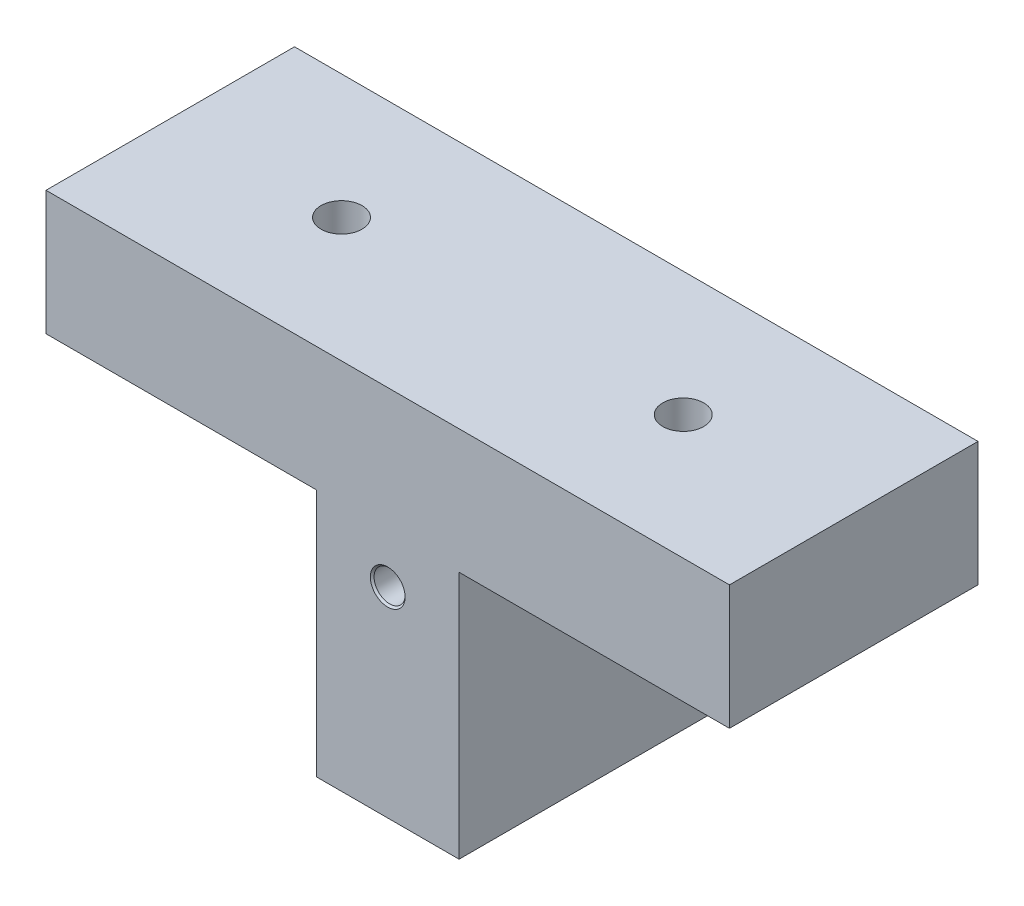
ISO-10303-21;
HEADER;
FILE_DESCRIPTION(('STEP AP214'),'2;1');
FILE_NAME('part.step','',(''),(''),'','','');
FILE_SCHEMA(('AUTOMOTIVE_DESIGN { 1 0 10303 214 1 1 1 1 }'));
ENDSEC;
DATA;
#1=APPLICATION_CONTEXT('core data for automotive mechanical design processes');
#2=APPLICATION_PROTOCOL_DEFINITION('international standard','automotive_design',2000,#1);
#3=PRODUCT_CONTEXT('',#1,'mechanical');
#4=PRODUCT('Part','Part','',(#3));
#5=PRODUCT_RELATED_PRODUCT_CATEGORY('part','',(#4));
#6=PRODUCT_DEFINITION_FORMATION('','',#4);
#7=PRODUCT_DEFINITION_CONTEXT('part definition',#1,'design');
#8=PRODUCT_DEFINITION('design','',#6,#7);
#9=PRODUCT_DEFINITION_SHAPE('','',#8);
#10=(LENGTH_UNIT() NAMED_UNIT(*) SI_UNIT(.MILLI.,.METRE.));
#11=(NAMED_UNIT(*) PLANE_ANGLE_UNIT() SI_UNIT($,.RADIAN.));
#12=(NAMED_UNIT(*) SI_UNIT($,.STERADIAN.) SOLID_ANGLE_UNIT());
#13=UNCERTAINTY_MEASURE_WITH_UNIT(LENGTH_MEASURE(1.E-05),#10,'distance_accuracy_value','');
#14=(GEOMETRIC_REPRESENTATION_CONTEXT(3) GLOBAL_UNCERTAINTY_ASSIGNED_CONTEXT((#13)) GLOBAL_UNIT_ASSIGNED_CONTEXT((#10,
#11,#12)) REPRESENTATION_CONTEXT('',''));
#15=CARTESIAN_POINT('',(0.,0.,0.));
#16=DIRECTION('',(0.,0.,1.));
#17=DIRECTION('',(1.,0.,0.));
#18=AXIS2_PLACEMENT_3D('',#15,#16,#17);
#19=CARTESIAN_POINT('',(27.5,5.,20.));
#20=DIRECTION('',(-1.,0.,0.));
#21=DIRECTION('',(0.,-1.,0.));
#22=AXIS2_PLACEMENT_3D('',#19,#20,#21);
#23=PLANE('',#22);
#24=DIRECTION('',(0.,1.,0.));
#25=VECTOR('',#24,1.);
#26=CARTESIAN_POINT('',(27.5,5.,0.));
#27=LINE('',#26,#25);
#28=CARTESIAN_POINT('',(27.5,-5.,0.));
#29=VERTEX_POINT('',#28);
#30=CARTESIAN_POINT('',(27.5,5.,0.));
#31=VERTEX_POINT('',#30);
#32=EDGE_CURVE('E139',#29,#31,#27,.T.);
#33=ORIENTED_EDGE('',*,*,#32,.T.);
#34=DIRECTION('',(0.,0.,-1.));
#35=VECTOR('',#34,1.);
#36=CARTESIAN_POINT('',(27.5,5.,20.));
#37=LINE('',#36,#35);
#38=CARTESIAN_POINT('',(27.5,5.,20.));
#39=VERTEX_POINT('',#38);
#40=EDGE_CURVE('E11',#39,#31,#37,.T.);
#41=ORIENTED_EDGE('',*,*,#40,.F.);
#42=DIRECTION('',(0.,1.,0.));
#43=VECTOR('',#42,1.);
#44=CARTESIAN_POINT('',(27.5,5.,20.));
#45=LINE('',#44,#43);
#46=CARTESIAN_POINT('',(27.5,-5.,20.));
#47=VERTEX_POINT('',#46);
#48=EDGE_CURVE('E162',#47,#39,#45,.T.);
#49=ORIENTED_EDGE('',*,*,#48,.F.);
#50=DIRECTION('',(0.,0.,-1.));
#51=VECTOR('',#50,1.);
#52=CARTESIAN_POINT('',(27.5,-5.,20.));
#53=LINE('',#52,#51);
#54=EDGE_CURVE('E135',#47,#29,#53,.T.);
#55=ORIENTED_EDGE('',*,*,#54,.T.);
#56=EDGE_LOOP('',(#33,#41,#49,#55));
#57=FACE_BOUND('',#56,.T.);
#58=ADVANCED_FACE('F38',(#57),#23,.F.);
#59=CARTESIAN_POINT('',(-27.5,5.,20.));
#60=DIRECTION('',(0.,-1.,0.));
#61=DIRECTION('',(0.,0.,-1.));
#62=AXIS2_PLACEMENT_3D('',#59,#60,#61);
#63=PLANE('',#62);
#64=CARTESIAN_POINT('',(13.78,4.99999999999999,10.));
#65=DIRECTION('',(0.,-1.,0.));
#66=DIRECTION('',(0.,0.,-1.));
#67=AXIS2_PLACEMENT_3D('',#64,#65,#66);
#68=CIRCLE('',#67,1.64999999999999);
#69=CARTESIAN_POINT('',(13.78,4.99999999999999,8.35000000000001));
#70=VERTEX_POINT('',#69);
#71=EDGE_CURVE('E229',#70,#70,#68,.T.);
#72=ORIENTED_EDGE('',*,*,#71,.T.);
#73=EDGE_LOOP('',(#72));
#74=FACE_BOUND('',#73,.T.);
#75=CARTESIAN_POINT('',(-13.72,4.99999999999999,10.));
#76=DIRECTION('',(0.,-1.,0.));
#77=DIRECTION('',(0.,0.,-1.));
#78=AXIS2_PLACEMENT_3D('',#75,#76,#77);
#79=CIRCLE('',#78,1.64999999999999);
#80=CARTESIAN_POINT('',(-13.72,4.99999999999999,8.35000000000001));
#81=VERTEX_POINT('',#80);
#82=EDGE_CURVE('E217',#81,#81,#79,.T.);
#83=ORIENTED_EDGE('',*,*,#82,.T.);
#84=EDGE_LOOP('',(#83));
#85=FACE_BOUND('',#84,.T.);
#86=DIRECTION('',(-1.,0.,0.));
#87=VECTOR('',#86,1.);
#88=CARTESIAN_POINT('',(-27.5,5.,0.));
#89=LINE('',#88,#87);
#90=CARTESIAN_POINT('',(-27.5,5.,0.));
#91=VERTEX_POINT('',#90);
#92=EDGE_CURVE('E143',#31,#91,#89,.T.);
#93=ORIENTED_EDGE('',*,*,#92,.T.);
#94=DIRECTION('',(0.,0.,-1.));
#95=VECTOR('',#94,1.);
#96=CARTESIAN_POINT('',(-27.5,5.,20.));
#97=LINE('',#96,#95);
#98=CARTESIAN_POINT('',(-27.5,5.,20.));
#99=VERTEX_POINT('',#98);
#100=EDGE_CURVE('E47',#99,#91,#97,.T.);
#101=ORIENTED_EDGE('',*,*,#100,.F.);
#102=DIRECTION('',(-1.,0.,0.));
#103=VECTOR('',#102,1.);
#104=CARTESIAN_POINT('',(-27.5,5.,20.));
#105=LINE('',#104,#103);
#106=EDGE_CURVE('E98',#39,#99,#105,.T.);
#107=ORIENTED_EDGE('',*,*,#106,.F.);
#108=ORIENTED_EDGE('',*,*,#40,.T.);
#109=EDGE_LOOP('',(#93,#101,#107,#108));
#110=FACE_BOUND('',#109,.T.);
#111=ADVANCED_FACE('F256',(#74,#85,#110),#63,.F.);
#112=CARTESIAN_POINT('',(-27.5,5.,20.));
#113=DIRECTION('',(1.,0.,0.));
#114=DIRECTION('',(0.,0.,-1.));
#115=AXIS2_PLACEMENT_3D('',#112,#113,#114);
#116=PLANE('',#115);
#117=DIRECTION('',(0.,-1.,0.));
#118=VECTOR('',#117,1.);
#119=CARTESIAN_POINT('',(-27.5,5.,0.));
#120=LINE('',#119,#118);
#121=CARTESIAN_POINT('',(-27.5,-5.,0.));
#122=VERTEX_POINT('',#121);
#123=EDGE_CURVE('E147',#91,#122,#120,.T.);
#124=ORIENTED_EDGE('',*,*,#123,.T.);
#125=DIRECTION('',(0.,0.,-1.));
#126=VECTOR('',#125,1.);
#127=CARTESIAN_POINT('',(-27.5,-5.,20.));
#128=LINE('',#127,#126);
#129=CARTESIAN_POINT('',(-27.5,-5.,20.));
#130=VERTEX_POINT('',#129);
#131=EDGE_CURVE('E173',#130,#122,#128,.T.);
#132=ORIENTED_EDGE('',*,*,#131,.F.);
#133=DIRECTION('',(0.,-1.,0.));
#134=VECTOR('',#133,1.);
#135=CARTESIAN_POINT('',(-27.5,5.,20.));
#136=LINE('',#135,#134);
#137=EDGE_CURVE('E183',#99,#130,#136,.T.);
#138=ORIENTED_EDGE('',*,*,#137,.F.);
#139=ORIENTED_EDGE('',*,*,#100,.T.);
#140=EDGE_LOOP('',(#124,#132,#138,#139));
#141=FACE_BOUND('',#140,.T.);
#142=ADVANCED_FACE('F181',(#141),#116,.F.);
#143=CARTESIAN_POINT('',(-27.5,-5.,20.));
#144=DIRECTION('',(0.,1.,0.));
#145=DIRECTION('',(0.,0.,1.));
#146=AXIS2_PLACEMENT_3D('',#143,#144,#145);
#147=PLANE('',#146);
#148=CARTESIAN_POINT('',(-13.72,-5.,10.));
#149=DIRECTION('',(0.,-1.,0.));
#150=DIRECTION('',(0.,0.,-1.));
#151=AXIS2_PLACEMENT_3D('',#148,#149,#150);
#152=CIRCLE('',#151,1.675);
#153=CARTESIAN_POINT('',(-13.72,-5.,8.325));
#154=VERTEX_POINT('',#153);
#155=EDGE_CURVE('E225',#154,#154,#152,.T.);
#156=ORIENTED_EDGE('',*,*,#155,.F.);
#157=EDGE_LOOP('',(#156));
#158=FACE_BOUND('',#157,.T.);
#159=DIRECTION('',(1.,0.,0.));
#160=VECTOR('',#159,1.);
#161=CARTESIAN_POINT('',(-27.5,-5.,0.));
#162=LINE('',#161,#160);
#163=CARTESIAN_POINT('',(-5.74072012964691,-5.,0.));
#164=VERTEX_POINT('',#163);
#165=EDGE_CURVE('E150',#122,#164,#162,.T.);
#166=ORIENTED_EDGE('',*,*,#165,.T.);
#167=DIRECTION('',(0.,0.,-1.));
#168=VECTOR('',#167,1.);
#169=CARTESIAN_POINT('',(-5.74072012964691,-5.,20.));
#170=LINE('',#169,#168);
#171=CARTESIAN_POINT('',(-5.74072012964691,-5.,20.));
#172=VERTEX_POINT('',#171);
#173=EDGE_CURVE('E169',#172,#164,#170,.T.);
#174=ORIENTED_EDGE('',*,*,#173,.F.);
#175=DIRECTION('',(1.,0.,0.));
#176=VECTOR('',#175,1.);
#177=CARTESIAN_POINT('',(-27.5,-5.,20.));
#178=LINE('',#177,#176);
#179=EDGE_CURVE('E196',#130,#172,#178,.T.);
#180=ORIENTED_EDGE('',*,*,#179,.F.);
#181=ORIENTED_EDGE('',*,*,#131,.T.);
#182=EDGE_LOOP('',(#166,#174,#180,#181));
#183=FACE_BOUND('',#182,.T.);
#184=ADVANCED_FACE('F191',(#158,#183),#147,.F.);
#185=CARTESIAN_POINT('',(-5.74072012964691,-5.,20.));
#186=DIRECTION('',(1.,0.,0.));
#187=DIRECTION('',(0.,1.,0.));
#188=AXIS2_PLACEMENT_3D('',#185,#186,#187);
#189=PLANE('',#188);
#190=DIRECTION('',(0.,-1.,0.));
#191=VECTOR('',#190,1.);
#192=CARTESIAN_POINT('',(-5.74072012964691,-5.,0.));
#193=LINE('',#192,#191);
#194=CARTESIAN_POINT('',(-5.74072012964691,-25.,0.));
#195=VERTEX_POINT('',#194);
#196=EDGE_CURVE('E153',#164,#195,#193,.T.);
#197=ORIENTED_EDGE('',*,*,#196,.T.);
#198=DIRECTION('',(0.,0.,-1.));
#199=VECTOR('',#198,1.);
#200=CARTESIAN_POINT('',(-5.74072012964691,-25.,20.));
#201=LINE('',#200,#199);
#202=CARTESIAN_POINT('',(-5.74072012964691,-25.,20.));
#203=VERTEX_POINT('',#202);
#204=EDGE_CURVE('E128',#203,#195,#201,.T.);
#205=ORIENTED_EDGE('',*,*,#204,.F.);
#206=DIRECTION('',(0.,-1.,0.));
#207=VECTOR('',#206,1.);
#208=CARTESIAN_POINT('',(-5.74072012964691,-5.,20.));
#209=LINE('',#208,#207);
#210=EDGE_CURVE('E117',#172,#203,#209,.T.);
#211=ORIENTED_EDGE('',*,*,#210,.F.);
#212=ORIENTED_EDGE('',*,*,#173,.T.);
#213=EDGE_LOOP('',(#197,#205,#211,#212));
#214=FACE_BOUND('',#213,.T.);
#215=ADVANCED_FACE('F194',(#214),#189,.F.);
#216=CARTESIAN_POINT('',(-5.74072012964691,-25.,20.));
#217=DIRECTION('',(0.,1.,0.));
#218=DIRECTION('',(0.,0.,1.));
#219=AXIS2_PLACEMENT_3D('',#216,#217,#218);
#220=PLANE('',#219);
#221=DIRECTION('',(1.,0.,0.));
#222=VECTOR('',#221,1.);
#223=CARTESIAN_POINT('',(-5.74072012964691,-25.,0.));
#224=LINE('',#223,#222);
#225=CARTESIAN_POINT('',(5.74072012964693,-25.,0.));
#226=VERTEX_POINT('',#225);
#227=EDGE_CURVE('E126',#195,#226,#224,.T.);
#228=ORIENTED_EDGE('',*,*,#227,.T.);
#229=DIRECTION('',(0.,0.,-1.));
#230=VECTOR('',#229,1.);
#231=CARTESIAN_POINT('',(5.74072012964693,-25.,20.));
#232=LINE('',#231,#230);
#233=CARTESIAN_POINT('',(5.74072012964693,-25.,20.));
#234=VERTEX_POINT('',#233);
#235=EDGE_CURVE('E123',#234,#226,#232,.T.);
#236=ORIENTED_EDGE('',*,*,#235,.F.);
#237=DIRECTION('',(1.,0.,0.));
#238=VECTOR('',#237,1.);
#239=CARTESIAN_POINT('',(-5.74072012964691,-25.,20.));
#240=LINE('',#239,#238);
#241=EDGE_CURVE('E111',#203,#234,#240,.T.);
#242=ORIENTED_EDGE('',*,*,#241,.F.);
#243=ORIENTED_EDGE('',*,*,#204,.T.);
#244=EDGE_LOOP('',(#228,#236,#242,#243));
#245=FACE_BOUND('',#244,.T.);
#246=ADVANCED_FACE('F124',(#245),#220,.F.);
#247=CARTESIAN_POINT('',(5.74072012964694,-5.,20.));
#248=DIRECTION('',(-1.,0.,0.));
#249=DIRECTION('',(0.,-1.,0.));
#250=AXIS2_PLACEMENT_3D('',#247,#248,#249);
#251=PLANE('',#250);
#252=DIRECTION('',(0.,1.,0.));
#253=VECTOR('',#252,1.);
#254=CARTESIAN_POINT('',(5.74072012964694,-5.,0.));
#255=LINE('',#254,#253);
#256=CARTESIAN_POINT('',(5.74072012964694,-5.,0.));
#257=VERTEX_POINT('',#256);
#258=EDGE_CURVE('E84',#226,#257,#255,.T.);
#259=ORIENTED_EDGE('',*,*,#258,.T.);
#260=DIRECTION('',(0.,0.,-1.));
#261=VECTOR('',#260,1.);
#262=CARTESIAN_POINT('',(5.74072012964694,-5.,20.));
#263=LINE('',#262,#261);
#264=CARTESIAN_POINT('',(5.74072012964694,-5.,20.));
#265=VERTEX_POINT('',#264);
#266=EDGE_CURVE('E129',#265,#257,#263,.T.);
#267=ORIENTED_EDGE('',*,*,#266,.F.);
#268=DIRECTION('',(0.,1.,0.));
#269=VECTOR('',#268,1.);
#270=CARTESIAN_POINT('',(5.74072012964694,-5.,20.));
#271=LINE('',#270,#269);
#272=EDGE_CURVE('E115',#234,#265,#271,.T.);
#273=ORIENTED_EDGE('',*,*,#272,.F.);
#274=ORIENTED_EDGE('',*,*,#235,.T.);
#275=EDGE_LOOP('',(#259,#267,#273,#274));
#276=FACE_BOUND('',#275,.T.);
#277=ADVANCED_FACE('F131',(#276),#251,.F.);
#278=CARTESIAN_POINT('',(5.74072012964694,-5.,20.));
#279=DIRECTION('',(0.,1.,0.));
#280=DIRECTION('',(0.,0.,1.));
#281=AXIS2_PLACEMENT_3D('',#278,#279,#280);
#282=PLANE('',#281);
#283=CARTESIAN_POINT('',(13.78,-5.,10.));
#284=DIRECTION('',(0.,-1.,0.));
#285=DIRECTION('',(0.,0.,-1.));
#286=AXIS2_PLACEMENT_3D('',#283,#284,#285);
#287=CIRCLE('',#286,1.675);
#288=CARTESIAN_POINT('',(13.78,-5.,8.325));
#289=VERTEX_POINT('',#288);
#290=EDGE_CURVE('E237',#289,#289,#287,.T.);
#291=ORIENTED_EDGE('',*,*,#290,.F.);
#292=EDGE_LOOP('',(#291));
#293=FACE_BOUND('',#292,.T.);
#294=DIRECTION('',(1.,0.,0.));
#295=VECTOR('',#294,1.);
#296=CARTESIAN_POINT('',(5.74072012964694,-5.,0.));
#297=LINE('',#296,#295);
#298=EDGE_CURVE('E90',#257,#29,#297,.T.);
#299=ORIENTED_EDGE('',*,*,#298,.T.);
#300=ORIENTED_EDGE('',*,*,#54,.F.);
#301=DIRECTION('',(1.,0.,0.));
#302=VECTOR('',#301,1.);
#303=CARTESIAN_POINT('',(5.74072012964694,-5.,20.));
#304=LINE('',#303,#302);
#305=EDGE_CURVE('E55',#265,#47,#304,.T.);
#306=ORIENTED_EDGE('',*,*,#305,.F.);
#307=ORIENTED_EDGE('',*,*,#266,.T.);
#308=EDGE_LOOP('',(#299,#300,#306,#307));
#309=FACE_BOUND('',#308,.T.);
#310=ADVANCED_FACE('F244',(#293,#309),#282,.F.);
#311=CARTESIAN_POINT('',(0.,0.,20.));
#312=DIRECTION('',(0.,0.,1.));
#313=DIRECTION('',(1.,0.,0.));
#314=AXIS2_PLACEMENT_3D('',#311,#312,#313);
#315=PLANE('',#314);
#316=CARTESIAN_POINT('',(0.,-8.9,20.));
#317=DIRECTION('',(0.,0.,1.));
#318=DIRECTION('',(1.,0.,0.));
#319=AXIS2_PLACEMENT_3D('',#316,#317,#318);
#320=CIRCLE('',#319,1.4);
#321=CARTESIAN_POINT('',(1.4,-8.9,20.));
#322=VERTEX_POINT('',#321);
#323=EDGE_CURVE('E213',#322,#322,#320,.T.);
#324=ORIENTED_EDGE('',*,*,#323,.F.);
#325=EDGE_LOOP('',(#324));
#326=FACE_BOUND('',#325,.T.);
#327=ORIENTED_EDGE('',*,*,#48,.T.);
#328=ORIENTED_EDGE('',*,*,#106,.T.);
#329=ORIENTED_EDGE('',*,*,#137,.T.);
#330=ORIENTED_EDGE('',*,*,#179,.T.);
#331=ORIENTED_EDGE('',*,*,#210,.T.);
#332=ORIENTED_EDGE('',*,*,#241,.T.);
#333=ORIENTED_EDGE('',*,*,#272,.T.);
#334=ORIENTED_EDGE('',*,*,#305,.T.);
#335=EDGE_LOOP('',(#327,#328,#329,#330,#331,#332,#333,#334));
#336=FACE_BOUND('',#335,.T.);
#337=ADVANCED_FACE('F113',(#326,#336),#315,.T.);
#338=CARTESIAN_POINT('',(0.,0.,0.));
#339=DIRECTION('',(0.,0.,1.));
#340=DIRECTION('',(1.,0.,0.));
#341=AXIS2_PLACEMENT_3D('',#338,#339,#340);
#342=PLANE('',#341);
#343=CARTESIAN_POINT('',(0.,-8.9,0.));
#344=DIRECTION('',(0.,0.,1.));
#345=DIRECTION('',(1.,0.,0.));
#346=AXIS2_PLACEMENT_3D('',#343,#344,#345);
#347=CIRCLE('',#346,1.24999999999999);
#348=CARTESIAN_POINT('',(1.24999999999999,-8.9,0.));
#349=VERTEX_POINT('',#348);
#350=EDGE_CURVE('E144',#349,#349,#347,.T.);
#351=ORIENTED_EDGE('',*,*,#350,.T.);
#352=EDGE_LOOP('',(#351));
#353=FACE_BOUND('',#352,.T.);
#354=ORIENTED_EDGE('',*,*,#32,.F.);
#355=ORIENTED_EDGE('',*,*,#298,.F.);
#356=ORIENTED_EDGE('',*,*,#258,.F.);
#357=ORIENTED_EDGE('',*,*,#227,.F.);
#358=ORIENTED_EDGE('',*,*,#196,.F.);
#359=ORIENTED_EDGE('',*,*,#165,.F.);
#360=ORIENTED_EDGE('',*,*,#123,.F.);
#361=ORIENTED_EDGE('',*,*,#92,.F.);
#362=EDGE_LOOP('',(#354,#355,#356,#357,#358,#359,#360,#361));
#363=FACE_BOUND('',#362,.T.);
#364=ADVANCED_FACE('F187',(#353,#363),#342,.F.);
#365=CARTESIAN_POINT('',(0.,-8.9,20.));
#366=DIRECTION('',(0.,0.,1.));
#367=DIRECTION('',(1.,0.,0.));
#368=AXIS2_PLACEMENT_3D('',#365,#366,#367);
#369=CYLINDRICAL_SURFACE('',#368,1.24999999999999);
#370=ORIENTED_EDGE('',*,*,#350,.F.);
#371=EDGE_LOOP('',(#370));
#372=FACE_BOUND('',#371,.T.);
#373=CARTESIAN_POINT('',(0.,-8.9,19.85));
#374=DIRECTION('',(0.,0.,1.));
#375=DIRECTION('',(1.,0.,0.));
#376=AXIS2_PLACEMENT_3D('',#373,#374,#375);
#377=CIRCLE('',#376,1.24999999999999);
#378=CARTESIAN_POINT('',(1.24999999999999,-8.9,19.85));
#379=VERTEX_POINT('',#378);
#380=EDGE_CURVE('E209',#379,#379,#377,.T.);
#381=ORIENTED_EDGE('',*,*,#380,.T.);
#382=EDGE_LOOP('',(#381));
#383=FACE_BOUND('',#382,.T.);
#384=ADVANCED_FACE('F300',(#372,#383),#369,.F.);
#385=CARTESIAN_POINT('',(0.,-8.9,20.));
#386=DIRECTION('',(0.,0.,1.));
#387=DIRECTION('',(1.,0.,0.));
#388=AXIS2_PLACEMENT_3D('',#385,#386,#387);
#389=CONICAL_SURFACE('',#388,1.4,0.785398163397456);
#390=ORIENTED_EDGE('',*,*,#380,.F.);
#391=EDGE_LOOP('',(#390));
#392=FACE_BOUND('',#391,.T.);
#393=ORIENTED_EDGE('',*,*,#323,.T.);
#394=EDGE_LOOP('',(#393));
#395=FACE_BOUND('',#394,.T.);
#396=ADVANCED_FACE('F309',(#392,#395),#389,.F.);
#397=CARTESIAN_POINT('',(-13.72,-5.,10.));
#398=DIRECTION('',(0.,-1.,0.));
#399=DIRECTION('',(0.,0.,-1.));
#400=AXIS2_PLACEMENT_3D('',#397,#398,#399);
#401=CYLINDRICAL_SURFACE('',#400,1.64999999999999);
#402=ORIENTED_EDGE('',*,*,#82,.F.);
#403=EDGE_LOOP('',(#402));
#404=FACE_BOUND('',#403,.T.);
#405=CARTESIAN_POINT('',(-13.72,-4.975,10.));
#406=DIRECTION('',(0.,-1.,0.));
#407=DIRECTION('',(0.,0.,-1.));
#408=AXIS2_PLACEMENT_3D('',#405,#406,#407);
#409=CIRCLE('',#408,1.65);
#410=CARTESIAN_POINT('',(-13.72,-4.975,8.35));
#411=VERTEX_POINT('',#410);
#412=EDGE_CURVE('E221',#411,#411,#409,.T.);
#413=ORIENTED_EDGE('',*,*,#412,.T.);
#414=EDGE_LOOP('',(#413));
#415=FACE_BOUND('',#414,.T.);
#416=ADVANCED_FACE('F318',(#404,#415),#401,.F.);
#417=CARTESIAN_POINT('',(-13.72,-5.,10.));
#418=DIRECTION('',(0.,-1.,0.));
#419=DIRECTION('',(0.,0.,-1.));
#420=AXIS2_PLACEMENT_3D('',#417,#418,#419);
#421=CONICAL_SURFACE('',#420,1.675,0.785398163397414);
#422=ORIENTED_EDGE('',*,*,#412,.F.);
#423=EDGE_LOOP('',(#422));
#424=FACE_BOUND('',#423,.T.);
#425=ORIENTED_EDGE('',*,*,#155,.T.);
#426=EDGE_LOOP('',(#425));
#427=FACE_BOUND('',#426,.T.);
#428=ADVANCED_FACE('F345',(#424,#427),#421,.F.);
#429=CARTESIAN_POINT('',(13.78,-5.,10.));
#430=DIRECTION('',(0.,-1.,0.));
#431=DIRECTION('',(0.,0.,-1.));
#432=AXIS2_PLACEMENT_3D('',#429,#430,#431);
#433=CYLINDRICAL_SURFACE('',#432,1.64999999999999);
#434=ORIENTED_EDGE('',*,*,#71,.F.);
#435=EDGE_LOOP('',(#434));
#436=FACE_BOUND('',#435,.T.);
#437=CARTESIAN_POINT('',(13.78,-4.975,10.));
#438=DIRECTION('',(0.,-1.,0.));
#439=DIRECTION('',(0.,0.,-1.));
#440=AXIS2_PLACEMENT_3D('',#437,#438,#439);
#441=CIRCLE('',#440,1.65);
#442=CARTESIAN_POINT('',(13.78,-4.975,8.35));
#443=VERTEX_POINT('',#442);
#444=EDGE_CURVE('E233',#443,#443,#441,.T.);
#445=ORIENTED_EDGE('',*,*,#444,.T.);
#446=EDGE_LOOP('',(#445));
#447=FACE_BOUND('',#446,.T.);
#448=ADVANCED_FACE('F355',(#436,#447),#433,.F.);
#449=CARTESIAN_POINT('',(13.78,-5.,10.));
#450=DIRECTION('',(0.,-1.,0.));
#451=DIRECTION('',(0.,0.,-1.));
#452=AXIS2_PLACEMENT_3D('',#449,#450,#451);
#453=CONICAL_SURFACE('',#452,1.675,0.785398163397414);
#454=ORIENTED_EDGE('',*,*,#444,.F.);
#455=EDGE_LOOP('',(#454));
#456=FACE_BOUND('',#455,.T.);
#457=ORIENTED_EDGE('',*,*,#290,.T.);
#458=EDGE_LOOP('',(#457));
#459=FACE_BOUND('',#458,.T.);
#460=ADVANCED_FACE('F242',(#456,#459),#453,.F.);
#461=CLOSED_SHELL('',(#58,#111,#142,#184,#215,#246,#277,#310,#337,#364,#384,#396,#416,#428,#448,#460));
#462=MANIFOLD_SOLID_BREP('B2',#461);
#463=ADVANCED_BREP_SHAPE_REPRESENTATION('',(#18,#462),#14);
#464=SHAPE_DEFINITION_REPRESENTATION(#9,#463);
ENDSEC;
END-ISO-10303-21;
